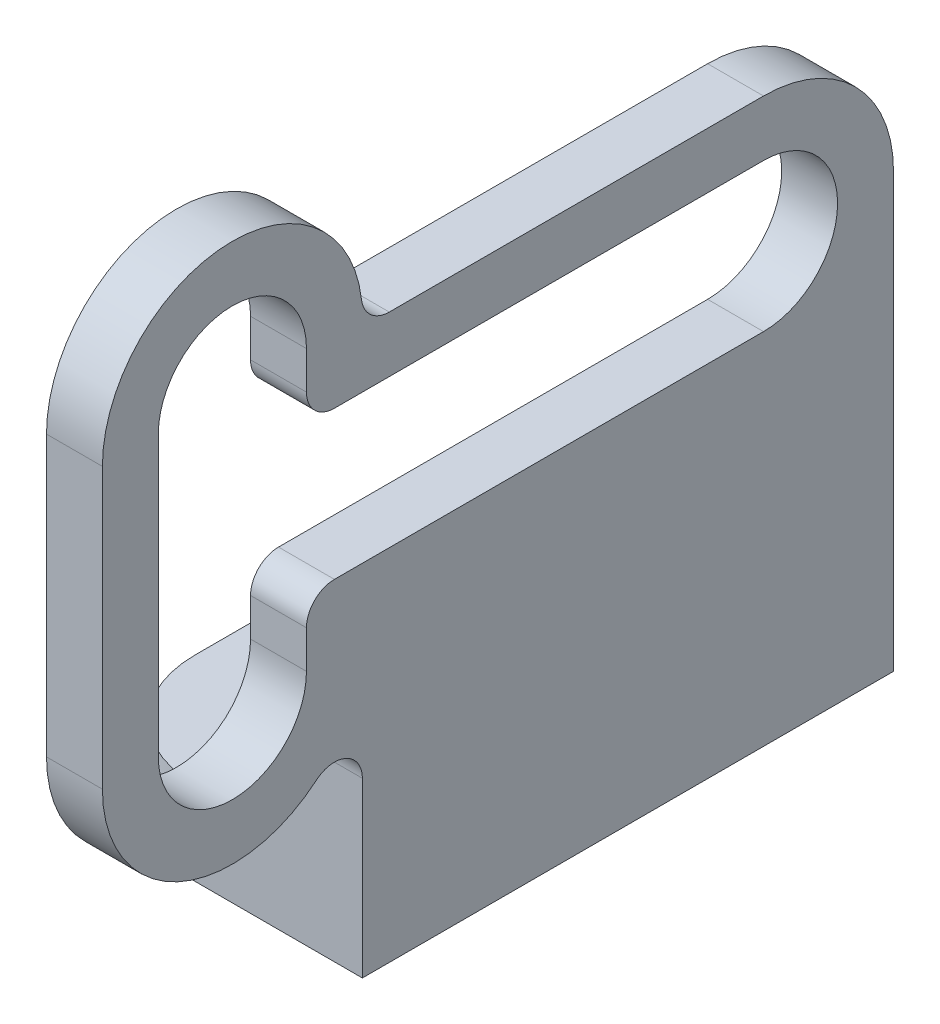
ISO-10303-21;
HEADER;
FILE_DESCRIPTION(('STEP AP214'),'2;1');
FILE_NAME('part.step','',(''),(''),'','','');
FILE_SCHEMA(('AUTOMOTIVE_DESIGN { 1 0 10303 214 1 1 1 1 }'));
ENDSEC;
DATA;
#1=APPLICATION_CONTEXT('core data for automotive mechanical design processes');
#2=APPLICATION_PROTOCOL_DEFINITION('international standard','automotive_design',2000,#1);
#3=PRODUCT_CONTEXT('',#1,'mechanical');
#4=PRODUCT('Part','Part','',(#3));
#5=PRODUCT_RELATED_PRODUCT_CATEGORY('part','',(#4));
#6=PRODUCT_DEFINITION_FORMATION('','',#4);
#7=PRODUCT_DEFINITION_CONTEXT('part definition',#1,'design');
#8=PRODUCT_DEFINITION('design','',#6,#7);
#9=PRODUCT_DEFINITION_SHAPE('','',#8);
#10=(LENGTH_UNIT() NAMED_UNIT(*) SI_UNIT(.MILLI.,.METRE.));
#11=(NAMED_UNIT(*) PLANE_ANGLE_UNIT() SI_UNIT($,.RADIAN.));
#12=(NAMED_UNIT(*) SI_UNIT($,.STERADIAN.) SOLID_ANGLE_UNIT());
#13=UNCERTAINTY_MEASURE_WITH_UNIT(LENGTH_MEASURE(1.E-05),#10,'distance_accuracy_value','');
#14=(GEOMETRIC_REPRESENTATION_CONTEXT(3) GLOBAL_UNCERTAINTY_ASSIGNED_CONTEXT((#13)) GLOBAL_UNIT_ASSIGNED_CONTEXT((#10,
#11,#12)) REPRESENTATION_CONTEXT('',''));
#15=CARTESIAN_POINT('',(0.,0.,0.));
#16=DIRECTION('',(0.,0.,1.));
#17=DIRECTION('',(1.,0.,0.));
#18=AXIS2_PLACEMENT_3D('',#15,#16,#17);
#19=CARTESIAN_POINT('',(-20.,-3.,-6.14999999999999));
#20=DIRECTION('',(0.,0.,-1.));
#21=DIRECTION('',(-1.,0.,0.));
#22=AXIS2_PLACEMENT_3D('',#19,#20,#21);
#23=CYLINDRICAL_SURFACE('',#22,4.);
#24=CARTESIAN_POINT('',(-20.,-7.,9.85000000000003));
#25=CARTESIAN_POINT('',(-19.9723233150158,-7.00000157780632,9.85000030077385));
#26=CARTESIAN_POINT('',(-19.9446602914708,-6.99971239882661,9.84885026689788));
#27=CARTESIAN_POINT('',(-19.8895402479927,-6.99856932536045,9.84426551968395));
#28=CARTESIAN_POINT('',(-19.8620831966923,-6.99771551870197,9.84083116167271));
#29=CARTESIAN_POINT('',(-19.7804278885431,-6.99433848960047,9.82715048730345));
#30=CARTESIAN_POINT('',(-19.7267894006055,-6.99099947175457,9.81352636101654));
#31=CARTESIAN_POINT('',(-19.6226488001989,-6.98250473560501,9.7777085120359));
#32=CARTESIAN_POINT('',(-19.572146569824,-6.97734908564534,9.75551511172608));
#33=CARTESIAN_POINT('',(-19.4755635423254,-6.96577019980751,9.70321851491648));
#34=CARTESIAN_POINT('',(-19.4294837750132,-6.95934666975096,9.67311348219123));
#35=CARTESIAN_POINT('',(-19.3421330009245,-6.94578302077196,9.60520070995904));
#36=CARTESIAN_POINT('',(-19.3009657505514,-6.938631915424,9.56726176327822));
#37=CARTESIAN_POINT('',(-19.2255034509248,-6.9244913182034,9.48503516637235));
#38=CARTESIAN_POINT('',(-19.1912096880392,-6.91750185679842,9.44074633042596));
#39=CARTESIAN_POINT('',(-19.1299814585968,-6.90436500143525,9.34626861825899));
#40=CARTESIAN_POINT('',(-19.1031637938485,-6.89823164771277,9.29600191845788));
#41=CARTESIAN_POINT('',(-19.0584011478602,-6.88766306914139,9.19149826378965));
#42=CARTESIAN_POINT('',(-19.040454292812,-6.88322748571199,9.13726215017519));
#43=CARTESIAN_POINT('',(-19.0142969191061,-6.87666988175583,9.02750495096397));
#44=CARTESIAN_POINT('',(-19.005898676279,-6.87450332247308,8.97203132676069));
#45=CARTESIAN_POINT('',(-18.9984921293181,-6.87259574483986,8.86042222547185));
#46=CARTESIAN_POINT('',(-18.9994825094147,-6.87285438660927,8.80428684222988));
#47=CARTESIAN_POINT('',(-19.0106756737874,-6.87572804296535,8.6943892169542));
#48=CARTESIAN_POINT('',(-19.0206545261121,-6.87828577652537,8.64060243542771));
#49=CARTESIAN_POINT('',(-19.0491840456145,-6.88537810505013,8.53549217150337));
#50=CARTESIAN_POINT('',(-19.0677352466789,-6.88991282314067,8.48416884274939));
#51=CARTESIAN_POINT('',(-19.113073935125,-6.90050082211051,8.3848407368435));
#52=CARTESIAN_POINT('',(-19.139942801472,-6.90656899329422,8.33687475958695));
#53=CARTESIAN_POINT('',(-19.2010966777035,-6.91953156775527,8.24605317888791));
#54=CARTESIAN_POINT('',(-19.2353828112966,-6.92642609615423,8.20319835130731));
#55=CARTESIAN_POINT('',(-19.3115531373298,-6.94050506331232,8.12253556836338));
#56=CARTESIAN_POINT('',(-19.3536255174734,-6.9476921736544,8.08490558417868));
#57=CARTESIAN_POINT('',(-19.4435819338675,-6.96137161942668,8.01719264017566));
#58=CARTESIAN_POINT('',(-19.4914674603803,-6.96786377589194,7.98711162170339));
#59=CARTESIAN_POINT('',(-19.591952127013,-6.97945529302574,7.93528313268396));
#60=CARTESIAN_POINT('',(-19.6445691952407,-6.98454903204387,7.91356916065193));
#61=CARTESIAN_POINT('',(-19.7528315230664,-6.99272331818904,7.87937181250502));
#62=CARTESIAN_POINT('',(-19.8084722183787,-6.99580681316378,7.86687491680075));
#63=CARTESIAN_POINT('',(-19.8871612160415,-6.99847177812262,7.85612756974165));
#64=CARTESIAN_POINT('',(-19.9096829103926,-6.99904410069706,7.85382928717722));
#65=CARTESIAN_POINT('',(-19.9547995093495,-6.99980800384184,7.8507672471564));
#66=CARTESIAN_POINT('',(-19.9773942321029,-7.00000021041085,7.85000096668091));
#67=CARTESIAN_POINT('',(-20.,-7.,7.84999999999999));
#68=B_SPLINE_CURVE_WITH_KNOTS('',3,(#24,#25,#26,#27,#28,#29,#30,#31,#32,#33,#34,#35,#36,#37,#38,
#39,#40,#41,#42,#43,#44,#45,#46,#47,#48,#49,#50,#51,#52,#53,#54,#55,#56,#57,#58,#59,#60,#61,#62,
#63,#64,#65,#66,#67),.UNSPECIFIED.,.F.,.F.,(4,2,2,2,2,2,2,2,2,2,2,2,2,2,2,2,2,2,2,2,2,4),(0.,
0.0829777568740204,0.165942609572148,0.331410183897194,0.496871533787462,0.662371319876779,
0.830908015660359,0.99947622356136,1.17054673796954,1.34158110117174,1.50919143567387,
1.6767782807557,1.84030207241865,2.00383604973177,2.16902348594667,2.33423596544216,
2.50414213597092,2.67409195611343,2.84471529197711,3.01508785741647,3.08298130683383,
3.15076285167842),.UNSPECIFIED.);
#69=CARTESIAN_POINT('',(-20.,-7.,9.85000000000003));
#70=VERTEX_POINT('',#69);
#71=CARTESIAN_POINT('',(-20.,-7.,7.85));
#72=VERTEX_POINT('',#71);
#73=EDGE_CURVE('E224',#70,#72,#68,.T.);
#74=ORIENTED_EDGE('',*,*,#73,.F.);
#75=DIRECTION('',(0.,0.,-1.));
#76=VECTOR('',#75,1.);
#77=CARTESIAN_POINT('',(-20.,-7.,-6.14999999999999));
#78=LINE('',#77,#76);
#79=CARTESIAN_POINT('',(-20.,-7.,12.85));
#80=VERTEX_POINT('',#79);
#81=EDGE_CURVE('E238',#80,#70,#78,.T.);
#82=ORIENTED_EDGE('',*,*,#81,.F.);
#83=CARTESIAN_POINT('',(-20.,-3.,12.85));
#84=DIRECTION('',(0.,0.,-1.));
#85=DIRECTION('',(0.,1.,0.));
#86=AXIS2_PLACEMENT_3D('',#83,#84,#85);
#87=CIRCLE('',#86,4.);
#88=CARTESIAN_POINT('',(-16.0834451217956,-3.81277173056957,12.85));
#89=VERTEX_POINT('',#88);
#90=EDGE_CURVE('E271',#89,#80,#87,.T.);
#91=ORIENTED_EDGE('',*,*,#90,.F.);
#92=CARTESIAN_POINT('',(-16.0834451217956,-3.81277173056957,12.85));
#93=CARTESIAN_POINT('',(-16.0778019953838,-3.78558602238399,12.8500000466087));
#94=CARTESIAN_POINT('',(-16.0724474853253,-3.75835212004865,12.8511094640094));
#95=CARTESIAN_POINT('',(-16.0623341735083,-3.70395442973958,12.8555632394884));
#96=CARTESIAN_POINT('',(-16.0575754239972,-3.67679064811963,12.8589077934219));
#97=CARTESIAN_POINT('',(-16.044243419014,-3.59579193120104,12.8722966076922));
#98=CARTESIAN_POINT('',(-16.0365870044108,-3.5423168308771,12.8856958915239));
#99=CARTESIAN_POINT('',(-16.0237028252213,-3.43799048877666,12.9212456464461));
#100=CARTESIAN_POINT('',(-16.0184786448804,-3.38714321688675,12.9434089442447));
#101=CARTESIAN_POINT('',(-16.0102034467824,-3.28968084018342,12.9959288242315));
#102=CARTESIAN_POINT('',(-16.0071518673569,-3.24306464425842,13.0262832860107));
#103=CARTESIAN_POINT('',(-16.003073968363,-3.16133815908622,13.0897752484205));
#104=CARTESIAN_POINT('',(-16.0018314800697,-3.12552277975823,13.1219985853475));
#105=CARTESIAN_POINT('',(-16.0002934395505,-3.05885238614823,13.1912664165865));
#106=CARTESIAN_POINT('',(-15.9999982499756,-3.02799927584719,13.2283127516243));
#107=CARTESIAN_POINT('',(-16.,-3.,13.2674177191272));
#108=B_SPLINE_CURVE_WITH_KNOTS('',3,(#92,#93,#94,#95,#96,#97,#98,#99,#100,#101,#102,#103,#104,
#105,#106,#107),.UNSPECIFIED.,.F.,.F.,(4,2,2,2,2,2,2,4),(0.,0.0832480723519854,
0.166503440324673,0.332612520237432,0.498965616849194,0.665275691641267,0.80935828184659,
0.953496024122987),.UNSPECIFIED.);
#109=CARTESIAN_POINT('',(-16.,-3.,13.2674177191272));
#110=VERTEX_POINT('',#109);
#111=EDGE_CURVE('E290',#89,#110,#108,.T.);
#112=ORIENTED_EDGE('',*,*,#111,.T.);
#113=DIRECTION('',(0.,0.,-1.));
#114=VECTOR('',#113,1.);
#115=CARTESIAN_POINT('',(-16.,-3.,17.5));
#116=LINE('',#115,#114);
#117=CARTESIAN_POINT('',(-16.,-3.,-6.14999999999999));
#118=VERTEX_POINT('',#117);
#119=EDGE_CURVE('E55',#118,#110,#116,.F.);
#120=ORIENTED_EDGE('',*,*,#119,.F.);
#121=CARTESIAN_POINT('',(-20.,-3.,-6.14999999999999));
#122=DIRECTION('',(0.,0.,-1.));
#123=DIRECTION('',(0.,1.,0.));
#124=AXIS2_PLACEMENT_3D('',#121,#122,#123);
#125=CIRCLE('',#124,4.);
#126=CARTESIAN_POINT('',(-20.,-7.,-6.14999999999999));
#127=VERTEX_POINT('',#126);
#128=EDGE_CURVE('E268',#127,#118,#125,.F.);
#129=ORIENTED_EDGE('',*,*,#128,.F.);
#130=CARTESIAN_POINT('',(-20.,-7.,-3.15));
#131=VERTEX_POINT('',#130);
#132=EDGE_CURVE('E220',#131,#127,#78,.T.);
#133=ORIENTED_EDGE('',*,*,#132,.F.);
#134=CARTESIAN_POINT('',(-20.,-7.,-1.14999999999998));
#135=CARTESIAN_POINT('',(-19.9723233150158,-7.00000157780632,-1.14999969922615));
#136=CARTESIAN_POINT('',(-19.9446602914708,-6.99971239882661,-1.15114973310212));
#137=CARTESIAN_POINT('',(-19.8895402479927,-6.99856932536045,-1.15573448031605));
#138=CARTESIAN_POINT('',(-19.8620831966923,-6.99771551870197,-1.1591688383273));
#139=CARTESIAN_POINT('',(-19.7804278885431,-6.99433848960047,-1.17284951269655));
#140=CARTESIAN_POINT('',(-19.7267894006055,-6.99099947175457,-1.18647363898346));
#141=CARTESIAN_POINT('',(-19.6226488001989,-6.98250473560501,-1.2222914879641));
#142=CARTESIAN_POINT('',(-19.572146569824,-6.97734908564534,-1.24448488827392));
#143=CARTESIAN_POINT('',(-19.4755635423254,-6.96577019980751,-1.29678148508352));
#144=CARTESIAN_POINT('',(-19.4294837750132,-6.95934666975096,-1.32688651780877));
#145=CARTESIAN_POINT('',(-19.3421330009245,-6.94578302077196,-1.39479929004097));
#146=CARTESIAN_POINT('',(-19.3009657505514,-6.938631915424,-1.43273823672178));
#147=CARTESIAN_POINT('',(-19.2255034509248,-6.9244913182034,-1.51496483362765));
#148=CARTESIAN_POINT('',(-19.1912096880392,-6.91750185679842,-1.55925366957404));
#149=CARTESIAN_POINT('',(-19.1299814585968,-6.90436500143525,-1.65373138174101));
#150=CARTESIAN_POINT('',(-19.1031637938485,-6.89823164771277,-1.70399808154212));
#151=CARTESIAN_POINT('',(-19.0584011478602,-6.88766306914139,-1.80850173621035));
#152=CARTESIAN_POINT('',(-19.040454292812,-6.88322748571199,-1.86273784982482));
#153=CARTESIAN_POINT('',(-19.0142969191061,-6.87666988175583,-1.97249504903603));
#154=CARTESIAN_POINT('',(-19.005898676279,-6.87450332247308,-2.02796867323932));
#155=CARTESIAN_POINT('',(-18.9984921293181,-6.87259574483986,-2.13957777452815));
#156=CARTESIAN_POINT('',(-18.9994825094147,-6.87285438660927,-2.19571315777013));
#157=CARTESIAN_POINT('',(-19.0106756737874,-6.87572804296535,-2.3056107830458));
#158=CARTESIAN_POINT('',(-19.0206545261121,-6.87828577652537,-2.35939756457229));
#159=CARTESIAN_POINT('',(-19.0491840456145,-6.88537810505013,-2.46450782849664));
#160=CARTESIAN_POINT('',(-19.0677352466789,-6.88991282314067,-2.51583115725061));
#161=CARTESIAN_POINT('',(-19.113073935125,-6.90050082211051,-2.61515926315651));
#162=CARTESIAN_POINT('',(-19.139942801472,-6.90656899329422,-2.66312524041305));
#163=CARTESIAN_POINT('',(-19.2010966777035,-6.91953156775527,-2.75394682111209));
#164=CARTESIAN_POINT('',(-19.2353828112966,-6.92642609615423,-2.79680164869269));
#165=CARTESIAN_POINT('',(-19.3115531373298,-6.94050506331232,-2.87746443163662));
#166=CARTESIAN_POINT('',(-19.3536255174734,-6.9476921736544,-2.91509441582132));
#167=CARTESIAN_POINT('',(-19.4435819338675,-6.96137161942668,-2.98280735982434));
#168=CARTESIAN_POINT('',(-19.4914674603803,-6.96786377589194,-3.01288837829661));
#169=CARTESIAN_POINT('',(-19.591952127013,-6.97945529302574,-3.06471686731604));
#170=CARTESIAN_POINT('',(-19.6445691952407,-6.98454903204387,-3.08643083934807));
#171=CARTESIAN_POINT('',(-19.7528315230664,-6.99272331818904,-3.12062818749498));
#172=CARTESIAN_POINT('',(-19.8084722183787,-6.99580681316378,-3.13312508319925));
#173=CARTESIAN_POINT('',(-19.8871612160415,-6.99847177812262,-3.14387243025835));
#174=CARTESIAN_POINT('',(-19.9096829103926,-6.99904410069706,-3.14617071282278));
#175=CARTESIAN_POINT('',(-19.9547995093495,-6.99980800384184,-3.14923275284361));
#176=CARTESIAN_POINT('',(-19.9773942321029,-7.00000021041085,-3.1499990333191));
#177=CARTESIAN_POINT('',(-20.,-7.,-3.15000000000002));
#178=B_SPLINE_CURVE_WITH_KNOTS('',3,(#134,#135,#136,#137,#138,#139,#140,#141,#142,#143,#144,
#145,#146,#147,#148,#149,#150,#151,#152,#153,#154,#155,#156,#157,#158,#159,#160,#161,#162,#163,
#164,#165,#166,#167,#168,#169,#170,#171,#172,#173,#174,#175,#176,#177),.UNSPECIFIED.,.F.,.F.,(4,
2,2,2,2,2,2,2,2,2,2,2,2,2,2,2,2,2,2,2,2,4),(0.,0.0829777568740205,0.165942609572148,
0.331410183897194,0.496871533787462,0.662371319876778,0.83090801566036,0.99947622356136,
1.17054673796954,1.34158110117174,1.50919143567387,1.67677828075569,1.84030207241865,
2.00383604973177,2.16902348594667,2.33423596544216,2.50414213597092,2.67409195611343,
2.84471529197711,3.01508785741647,3.08298130683383,3.15076285167842),.UNSPECIFIED.);
#179=CARTESIAN_POINT('',(-20.,-7.,-1.14999999999998));
#180=VERTEX_POINT('',#179);
#181=EDGE_CURVE('E215',#180,#131,#178,.T.);
#182=ORIENTED_EDGE('',*,*,#181,.F.);
#183=EDGE_CURVE('E218',#72,#180,#78,.T.);
#184=ORIENTED_EDGE('',*,*,#183,.F.);
#185=EDGE_LOOP('',(#74,#82,#91,#112,#120,#129,#133,#182,#184));
#186=FACE_BOUND('',#185,.T.);
#187=ADVANCED_FACE('F39',(#186),#23,.F.);
#188=CARTESIAN_POINT('',(-24.,-7.,-6.14999999999999));
#189=DIRECTION('',(0.,-1.,0.));
#190=DIRECTION('',(0.,0.,-1.));
#191=AXIS2_PLACEMENT_3D('',#188,#189,#190);
#192=PLANE('',#191);
#193=ORIENTED_EDGE('',*,*,#183,.T.);
#194=CARTESIAN_POINT('',(-20.,-7.,-2.14999999999999));
#195=DIRECTION('',(0.,1.,0.));
#196=DIRECTION('',(0.,0.,1.));
#197=AXIS2_PLACEMENT_3D('',#194,#195,#196);
#198=CIRCLE('',#197,1.00000000000001);
#199=EDGE_CURVE('E226',#131,#180,#198,.T.);
#200=ORIENTED_EDGE('',*,*,#199,.F.);
#201=ORIENTED_EDGE('',*,*,#132,.T.);
#202=CARTESIAN_POINT('',(-20.,-7.,-2.14999999999999));
#203=DIRECTION('',(0.,-1.,0.));
#204=DIRECTION('',(0.,0.,-1.));
#205=AXIS2_PLACEMENT_3D('',#202,#203,#204);
#206=CIRCLE('',#205,4.);
#207=CARTESIAN_POINT('',(-24.,-7.,-2.14999999999999));
#208=VERTEX_POINT('',#207);
#209=EDGE_CURVE('E242',#127,#208,#206,.F.);
#210=ORIENTED_EDGE('',*,*,#209,.T.);
#211=DIRECTION('',(0.,0.,-1.));
#212=VECTOR('',#211,1.);
#213=CARTESIAN_POINT('',(-24.,-7.,-6.14999999999999));
#214=LINE('',#213,#212);
#215=CARTESIAN_POINT('',(-24.,-7.,8.85));
#216=VERTEX_POINT('',#215);
#217=EDGE_CURVE('E420',#216,#208,#214,.T.);
#218=ORIENTED_EDGE('',*,*,#217,.F.);
#219=CARTESIAN_POINT('',(-20.,-7.,8.85));
#220=DIRECTION('',(0.,-1.,0.));
#221=DIRECTION('',(0.,0.,-1.));
#222=AXIS2_PLACEMENT_3D('',#219,#220,#221);
#223=CIRCLE('',#222,4.);
#224=EDGE_CURVE('E249',#216,#80,#223,.F.);
#225=ORIENTED_EDGE('',*,*,#224,.T.);
#226=ORIENTED_EDGE('',*,*,#81,.T.);
#227=CARTESIAN_POINT('',(-20.,-7.,8.85000000000001));
#228=DIRECTION('',(0.,1.,0.));
#229=DIRECTION('',(0.,0.,1.));
#230=AXIS2_PLACEMENT_3D('',#227,#228,#229);
#231=CIRCLE('',#230,1.00000000000001);
#232=EDGE_CURVE('E236',#72,#70,#231,.T.);
#233=ORIENTED_EDGE('',*,*,#232,.F.);
#234=EDGE_LOOP('',(#193,#200,#201,#210,#218,#225,#226,#233));
#235=FACE_BOUND('',#234,.T.);
#236=ADVANCED_FACE('F233',(#235),#192,.F.);
#237=CARTESIAN_POINT('',(-16.,5.5,-1.50000000000001));
#238=DIRECTION('',(1.,0.,0.));
#239=DIRECTION('',(0.,0.,-1.));
#240=AXIS2_PLACEMENT_3D('',#237,#238,#239);
#241=CYLINDRICAL_SURFACE('',#240,4.65);
#242=DIRECTION('',(1.,0.,0.));
#243=VECTOR('',#242,1.);
#244=CARTESIAN_POINT('',(-16.,5.5,-6.15));
#245=LINE('',#244,#243);
#246=CARTESIAN_POINT('',(-14.,5.5,-6.15));
#247=VERTEX_POINT('',#246);
#248=CARTESIAN_POINT('',(-16.,5.5,-6.15));
#249=VERTEX_POINT('',#248);
#250=EDGE_CURVE('E448',#247,#249,#245,.F.);
#251=ORIENTED_EDGE('',*,*,#250,.T.);
#252=CARTESIAN_POINT('',(-16.,5.5,-1.50000000000001));
#253=DIRECTION('',(-1.,0.,0.));
#254=DIRECTION('',(0.,0.,1.));
#255=AXIS2_PLACEMENT_3D('',#252,#253,#254);
#256=CIRCLE('',#255,4.65);
#257=CARTESIAN_POINT('',(-16.,10.15,-1.50000000000001));
#258=VERTEX_POINT('',#257);
#259=EDGE_CURVE('E566',#258,#249,#256,.T.);
#260=ORIENTED_EDGE('',*,*,#259,.F.);
#261=DIRECTION('',(1.,0.,0.));
#262=VECTOR('',#261,1.);
#263=CARTESIAN_POINT('',(-16.,10.15,-1.50000000000001));
#264=LINE('',#263,#262);
#265=CARTESIAN_POINT('',(-14.,10.15,-1.50000000000001));
#266=VERTEX_POINT('',#265);
#267=EDGE_CURVE('E602',#258,#266,#264,.T.);
#268=ORIENTED_EDGE('',*,*,#267,.T.);
#269=CARTESIAN_POINT('',(-14.,5.5,-1.50000000000001));
#270=DIRECTION('',(-1.,0.,0.));
#271=DIRECTION('',(0.,0.,1.));
#272=AXIS2_PLACEMENT_3D('',#269,#270,#271);
#273=CIRCLE('',#272,4.65);
#274=EDGE_CURVE('E583',#266,#247,#273,.T.);
#275=ORIENTED_EDGE('',*,*,#274,.T.);
#276=EDGE_LOOP('',(#251,#260,#268,#275));
#277=FACE_BOUND('',#276,.T.);
#278=ADVANCED_FACE('F318',(#277),#241,.T.);
#279=CARTESIAN_POINT('',(-16.,10.5,17.5));
#280=DIRECTION('',(-1.,0.,0.));
#281=DIRECTION('',(0.,0.,1.));
#282=AXIS2_PLACEMENT_3D('',#279,#280,#281);
#283=PLANE('',#282);
#284=DIRECTION('',(0.,-1.,0.));
#285=VECTOR('',#284,1.);
#286=CARTESIAN_POINT('',(-16.,15.152,-6.15));
#287=LINE('',#286,#285);
#288=EDGE_CURVE('E454',#249,#118,#287,.T.);
#289=ORIENTED_EDGE('',*,*,#288,.T.);
#290=ORIENTED_EDGE('',*,*,#119,.T.);
#291=CARTESIAN_POINT('',(-16.,-3.81277173056957,13.85));
#292=DIRECTION('',(-1.,0.,0.));
#293=DIRECTION('',(0.,0.,1.));
#294=AXIS2_PLACEMENT_3D('',#291,#292,#293);
#295=CIRCLE('',#294,1.);
#296=CARTESIAN_POINT('',(-16.,-3.04944930038027,14.496017699115));
#297=VERTEX_POINT('',#296);
#298=EDGE_CURVE('E298',#110,#297,#295,.F.);
#299=ORIENTED_EDGE('',*,*,#298,.T.);
#300=CARTESIAN_POINT('',(-16.,0.500000000000005,17.5));
#301=DIRECTION('',(-1.,0.,0.));
#302=DIRECTION('',(0.,0.,1.));
#303=AXIS2_PLACEMENT_3D('',#300,#301,#302);
#304=CIRCLE('',#303,4.65);
#305=CARTESIAN_POINT('',(-16.,0.500000000000005,22.15));
#306=VERTEX_POINT('',#305);
#307=EDGE_CURVE('E571',#297,#306,#304,.T.);
#308=ORIENTED_EDGE('',*,*,#307,.T.);
#309=DIRECTION('',(0.,1.,0.));
#310=VECTOR('',#309,1.);
#311=CARTESIAN_POINT('',(-16.,0.500000000000003,22.15));
#312=LINE('',#311,#310);
#313=CARTESIAN_POINT('',(-16.,10.5,22.15));
#314=VERTEX_POINT('',#313);
#315=EDGE_CURVE('E574',#306,#314,#312,.T.);
#316=ORIENTED_EDGE('',*,*,#315,.T.);
#317=CARTESIAN_POINT('',(-16.,10.5,17.5));
#318=DIRECTION('',(-1.,0.,0.));
#319=DIRECTION('',(0.,0.,1.));
#320=AXIS2_PLACEMENT_3D('',#317,#318,#319);
#321=CIRCLE('',#320,4.65);
#322=CARTESIAN_POINT('',(-16.,11.0349557522124,12.8808742880091));
#323=VERTEX_POINT('',#322);
#324=EDGE_CURVE('E577',#314,#323,#321,.T.);
#325=ORIENTED_EDGE('',*,*,#324,.T.);
#326=CARTESIAN_POINT('',(-16.,11.15,11.8875139198391));
#327=DIRECTION('',(-1.,0.,0.));
#328=DIRECTION('',(0.,0.,1.));
#329=AXIS2_PLACEMENT_3D('',#326,#327,#328);
#330=CIRCLE('',#329,1.);
#331=CARTESIAN_POINT('',(-16.,10.15,11.8875139198391));
#332=VERTEX_POINT('',#331);
#333=EDGE_CURVE('E11',#323,#332,#330,.F.);
#334=ORIENTED_EDGE('',*,*,#333,.T.);
#335=DIRECTION('',(0.,0.,-1.));
#336=VECTOR('',#335,1.);
#337=CARTESIAN_POINT('',(-16.,10.15,12.85));
#338=LINE('',#337,#336);
#339=EDGE_CURVE('E563',#332,#258,#338,.T.);
#340=ORIENTED_EDGE('',*,*,#339,.T.);
#341=ORIENTED_EDGE('',*,*,#259,.T.);
#342=EDGE_LOOP('',(#289,#290,#299,#308,#316,#325,#334,#340,#341));
#343=FACE_BOUND('',#342,.T.);
#344=DIRECTION('',(0.,0.,-1.));
#345=VECTOR('',#344,1.);
#346=CARTESIAN_POINT('',(-16.,8.15,13.85));
#347=LINE('',#346,#345);
#348=CARTESIAN_POINT('',(-16.,8.15,13.85));
#349=VERTEX_POINT('',#348);
#350=CARTESIAN_POINT('',(-16.,8.15,-1.50000000000001));
#351=VERTEX_POINT('',#350);
#352=EDGE_CURVE('E463',#349,#351,#347,.T.);
#353=ORIENTED_EDGE('',*,*,#352,.F.);
#354=CARTESIAN_POINT('',(-16.,9.15,13.85));
#355=DIRECTION('',(1.,0.,0.));
#356=DIRECTION('',(0.,0.,1.));
#357=AXIS2_PLACEMENT_3D('',#354,#355,#356);
#358=CIRCLE('',#357,0.999999999999997);
#359=CARTESIAN_POINT('',(-16.,9.15,14.85));
#360=VERTEX_POINT('',#359);
#361=EDGE_CURVE('E460',#360,#349,#358,.T.);
#362=ORIENTED_EDGE('',*,*,#361,.F.);
#363=DIRECTION('',(0.,-1.,0.));
#364=VECTOR('',#363,1.);
#365=CARTESIAN_POINT('',(-16.,9.15,14.85));
#366=LINE('',#365,#364);
#367=CARTESIAN_POINT('',(-16.,10.5,14.85));
#368=VERTEX_POINT('',#367);
#369=EDGE_CURVE('E489',#368,#360,#366,.T.);
#370=ORIENTED_EDGE('',*,*,#369,.F.);
#371=CARTESIAN_POINT('',(-16.,10.5,17.5));
#372=DIRECTION('',(-1.,0.,0.));
#373=DIRECTION('',(0.,0.,1.));
#374=AXIS2_PLACEMENT_3D('',#371,#372,#373);
#375=CIRCLE('',#374,2.65);
#376=CARTESIAN_POINT('',(-16.,10.5,20.15));
#377=VERTEX_POINT('',#376);
#378=EDGE_CURVE('E485',#377,#368,#375,.T.);
#379=ORIENTED_EDGE('',*,*,#378,.F.);
#380=DIRECTION('',(0.,1.,0.));
#381=VECTOR('',#380,1.);
#382=CARTESIAN_POINT('',(-16.,0.500000000000005,20.15));
#383=LINE('',#382,#381);
#384=CARTESIAN_POINT('',(-16.,0.500000000000005,20.15));
#385=VERTEX_POINT('',#384);
#386=EDGE_CURVE('E482',#385,#377,#383,.T.);
#387=ORIENTED_EDGE('',*,*,#386,.F.);
#388=CARTESIAN_POINT('',(-16.,0.500000000000005,17.5));
#389=DIRECTION('',(-1.,0.,0.));
#390=DIRECTION('',(0.,0.,1.));
#391=AXIS2_PLACEMENT_3D('',#388,#389,#390);
#392=CIRCLE('',#391,2.65);
#393=CARTESIAN_POINT('',(-16.,0.500000000000003,14.85));
#394=VERTEX_POINT('',#393);
#395=EDGE_CURVE('E479',#394,#385,#392,.T.);
#396=ORIENTED_EDGE('',*,*,#395,.F.);
#397=DIRECTION('',(0.,-1.,0.));
#398=VECTOR('',#397,1.);
#399=CARTESIAN_POINT('',(-16.,0.500000000000003,14.85));
#400=LINE('',#399,#398);
#401=CARTESIAN_POINT('',(-16.,1.85000000000001,14.85));
#402=VERTEX_POINT('',#401);
#403=EDGE_CURVE('E476',#402,#394,#400,.T.);
#404=ORIENTED_EDGE('',*,*,#403,.F.);
#405=CARTESIAN_POINT('',(-16.,1.85000000000001,13.85));
#406=DIRECTION('',(1.,0.,0.));
#407=DIRECTION('',(0.,0.,1.));
#408=AXIS2_PLACEMENT_3D('',#405,#406,#407);
#409=CIRCLE('',#408,0.999999999999998);
#410=CARTESIAN_POINT('',(-16.,2.85,13.85));
#411=VERTEX_POINT('',#410);
#412=EDGE_CURVE('E473',#411,#402,#409,.T.);
#413=ORIENTED_EDGE('',*,*,#412,.F.);
#414=DIRECTION('',(0.,0.,1.));
#415=VECTOR('',#414,1.);
#416=CARTESIAN_POINT('',(-16.,2.85,13.85));
#417=LINE('',#416,#415);
#418=CARTESIAN_POINT('',(-16.,2.85,-1.50000000000001));
#419=VERTEX_POINT('',#418);
#420=EDGE_CURVE('E470',#419,#411,#417,.T.);
#421=ORIENTED_EDGE('',*,*,#420,.F.);
#422=CARTESIAN_POINT('',(-16.,5.5,-1.50000000000001));
#423=DIRECTION('',(-1.,0.,0.));
#424=DIRECTION('',(0.,0.,1.));
#425=AXIS2_PLACEMENT_3D('',#422,#423,#424);
#426=CIRCLE('',#425,2.65);
#427=EDGE_CURVE('E467',#351,#419,#426,.T.);
#428=ORIENTED_EDGE('',*,*,#427,.F.);
#429=EDGE_LOOP('',(#353,#362,#370,#379,#387,#396,#404,#413,#421,#428));
#430=FACE_BOUND('',#429,.T.);
#431=ADVANCED_FACE('F323',(#343,#430),#283,.T.);
#432=CARTESIAN_POINT('',(-14.,10.5,17.5));
#433=DIRECTION('',(-1.,0.,0.));
#434=DIRECTION('',(0.,0.,1.));
#435=AXIS2_PLACEMENT_3D('',#432,#433,#434);
#436=PLANE('',#435);
#437=DIRECTION('',(0.,0.,-1.));
#438=VECTOR('',#437,1.);
#439=CARTESIAN_POINT('',(-14.,10.15,12.85));
#440=LINE('',#439,#438);
#441=CARTESIAN_POINT('',(-14.,10.15,11.8875139198391));
#442=VERTEX_POINT('',#441);
#443=EDGE_CURVE('E562',#442,#266,#440,.T.);
#444=ORIENTED_EDGE('',*,*,#443,.F.);
#445=CARTESIAN_POINT('',(-14.,11.15,11.8875139198391));
#446=DIRECTION('',(-1.,0.,0.));
#447=DIRECTION('',(0.,0.,1.));
#448=AXIS2_PLACEMENT_3D('',#445,#446,#447);
#449=CIRCLE('',#448,1.);
#450=CARTESIAN_POINT('',(-14.,11.0349557522124,12.8808742880091));
#451=VERTEX_POINT('',#450);
#452=EDGE_CURVE('E48',#442,#451,#449,.T.);
#453=ORIENTED_EDGE('',*,*,#452,.T.);
#454=CARTESIAN_POINT('',(-14.,10.5,17.5));
#455=DIRECTION('',(-1.,0.,0.));
#456=DIRECTION('',(0.,0.,1.));
#457=AXIS2_PLACEMENT_3D('',#454,#455,#456);
#458=CIRCLE('',#457,4.65);
#459=CARTESIAN_POINT('',(-14.,10.5,22.15));
#460=VERTEX_POINT('',#459);
#461=EDGE_CURVE('E567',#460,#451,#458,.T.);
#462=ORIENTED_EDGE('',*,*,#461,.F.);
#463=DIRECTION('',(0.,1.,0.));
#464=VECTOR('',#463,1.);
#465=CARTESIAN_POINT('',(-14.,0.500000000000003,22.15));
#466=LINE('',#465,#464);
#467=CARTESIAN_POINT('',(-14.,0.500000000000005,22.15));
#468=VERTEX_POINT('',#467);
#469=EDGE_CURVE('E590',#468,#460,#466,.T.);
#470=ORIENTED_EDGE('',*,*,#469,.F.);
#471=CARTESIAN_POINT('',(-14.,0.500000000000005,17.5));
#472=DIRECTION('',(-1.,0.,0.));
#473=DIRECTION('',(0.,0.,1.));
#474=AXIS2_PLACEMENT_3D('',#471,#472,#473);
#475=CIRCLE('',#474,4.65);
#476=CARTESIAN_POINT('',(-14.,-3.04944930038027,14.496017699115));
#477=VERTEX_POINT('',#476);
#478=EDGE_CURVE('E587',#477,#468,#475,.T.);
#479=ORIENTED_EDGE('',*,*,#478,.F.);
#480=CARTESIAN_POINT('',(-14.,-3.81277173056957,13.85));
#481=DIRECTION('',(-1.,0.,0.));
#482=DIRECTION('',(0.,0.,1.));
#483=AXIS2_PLACEMENT_3D('',#480,#481,#482);
#484=CIRCLE('',#483,1.);
#485=CARTESIAN_POINT('',(-14.,-3.81277173056957,12.85));
#486=VERTEX_POINT('',#485);
#487=EDGE_CURVE('E287',#477,#486,#484,.T.);
#488=ORIENTED_EDGE('',*,*,#487,.T.);
#489=DIRECTION('',(0.,1.,0.));
#490=VECTOR('',#489,1.);
#491=CARTESIAN_POINT('',(-14.,-9.99999999999999,12.85));
#492=LINE('',#491,#490);
#493=CARTESIAN_POINT('',(-14.,-9.99999999999999,12.85));
#494=VERTEX_POINT('',#493);
#495=EDGE_CURVE('E444',#494,#486,#492,.T.);
#496=ORIENTED_EDGE('',*,*,#495,.F.);
#497=DIRECTION('',(0.,0.,1.));
#498=VECTOR('',#497,1.);
#499=CARTESIAN_POINT('',(-14.,-10.,-6.14999999999999));
#500=LINE('',#499,#498);
#501=CARTESIAN_POINT('',(-14.,-10.,-6.14999999999999));
#502=VERTEX_POINT('',#501);
#503=EDGE_CURVE('E432',#502,#494,#500,.T.);
#504=ORIENTED_EDGE('',*,*,#503,.F.);
#505=DIRECTION('',(0.,-1.,0.));
#506=VECTOR('',#505,1.);
#507=CARTESIAN_POINT('',(-14.,15.152,-6.15));
#508=LINE('',#507,#506);
#509=EDGE_CURVE('E449',#247,#502,#508,.T.);
#510=ORIENTED_EDGE('',*,*,#509,.F.);
#511=ORIENTED_EDGE('',*,*,#274,.F.);
#512=EDGE_LOOP('',(#444,#453,#462,#470,#479,#488,#496,#504,#510,#511));
#513=FACE_BOUND('',#512,.T.);
#514=CARTESIAN_POINT('',(-14.,9.15,13.85));
#515=DIRECTION('',(1.,0.,0.));
#516=DIRECTION('',(0.,0.,1.));
#517=AXIS2_PLACEMENT_3D('',#514,#515,#516);
#518=CIRCLE('',#517,0.999999999999997);
#519=CARTESIAN_POINT('',(-14.,9.15,14.85));
#520=VERTEX_POINT('',#519);
#521=CARTESIAN_POINT('',(-14.,8.15,13.85));
#522=VERTEX_POINT('',#521);
#523=EDGE_CURVE('E453',#520,#522,#518,.T.);
#524=ORIENTED_EDGE('',*,*,#523,.T.);
#525=DIRECTION('',(0.,0.,-1.));
#526=VECTOR('',#525,1.);
#527=CARTESIAN_POINT('',(-14.,8.15,13.85));
#528=LINE('',#527,#526);
#529=CARTESIAN_POINT('',(-14.,8.15,-1.50000000000001));
#530=VERTEX_POINT('',#529);
#531=EDGE_CURVE('E496',#522,#530,#528,.T.);
#532=ORIENTED_EDGE('',*,*,#531,.T.);
#533=CARTESIAN_POINT('',(-14.,5.5,-1.50000000000001));
#534=DIRECTION('',(-1.,0.,0.));
#535=DIRECTION('',(0.,0.,1.));
#536=AXIS2_PLACEMENT_3D('',#533,#534,#535);
#537=CIRCLE('',#536,2.65);
#538=CARTESIAN_POINT('',(-14.,2.85,-1.50000000000001));
#539=VERTEX_POINT('',#538);
#540=EDGE_CURVE('E500',#530,#539,#537,.T.);
#541=ORIENTED_EDGE('',*,*,#540,.T.);
#542=DIRECTION('',(0.,0.,1.));
#543=VECTOR('',#542,1.);
#544=CARTESIAN_POINT('',(-14.,2.85,13.85));
#545=LINE('',#544,#543);
#546=CARTESIAN_POINT('',(-14.,2.85,13.85));
#547=VERTEX_POINT('',#546);
#548=EDGE_CURVE('E504',#539,#547,#545,.T.);
#549=ORIENTED_EDGE('',*,*,#548,.T.);
#550=CARTESIAN_POINT('',(-14.,1.85000000000001,13.85));
#551=DIRECTION('',(1.,0.,0.));
#552=DIRECTION('',(0.,0.,1.));
#553=AXIS2_PLACEMENT_3D('',#550,#551,#552);
#554=CIRCLE('',#553,0.999999999999998);
#555=CARTESIAN_POINT('',(-14.,1.85000000000001,14.85));
#556=VERTEX_POINT('',#555);
#557=EDGE_CURVE('E508',#547,#556,#554,.T.);
#558=ORIENTED_EDGE('',*,*,#557,.T.);
#559=DIRECTION('',(0.,-1.,0.));
#560=VECTOR('',#559,1.);
#561=CARTESIAN_POINT('',(-14.,0.500000000000003,14.85));
#562=LINE('',#561,#560);
#563=CARTESIAN_POINT('',(-14.,0.500000000000003,14.85));
#564=VERTEX_POINT('',#563);
#565=EDGE_CURVE('E512',#556,#564,#562,.T.);
#566=ORIENTED_EDGE('',*,*,#565,.T.);
#567=CARTESIAN_POINT('',(-14.,0.500000000000005,17.5));
#568=DIRECTION('',(-1.,0.,0.));
#569=DIRECTION('',(0.,0.,1.));
#570=AXIS2_PLACEMENT_3D('',#567,#568,#569);
#571=CIRCLE('',#570,2.65);
#572=CARTESIAN_POINT('',(-14.,0.500000000000005,20.15));
#573=VERTEX_POINT('',#572);
#574=EDGE_CURVE('E516',#564,#573,#571,.T.);
#575=ORIENTED_EDGE('',*,*,#574,.T.);
#576=DIRECTION('',(0.,1.,0.));
#577=VECTOR('',#576,1.);
#578=CARTESIAN_POINT('',(-14.,0.500000000000005,20.15));
#579=LINE('',#578,#577);
#580=CARTESIAN_POINT('',(-14.,10.5,20.15));
#581=VERTEX_POINT('',#580);
#582=EDGE_CURVE('E520',#573,#581,#579,.T.);
#583=ORIENTED_EDGE('',*,*,#582,.T.);
#584=CARTESIAN_POINT('',(-14.,10.5,17.5));
#585=DIRECTION('',(-1.,0.,0.));
#586=DIRECTION('',(0.,0.,1.));
#587=AXIS2_PLACEMENT_3D('',#584,#585,#586);
#588=CIRCLE('',#587,2.65);
#589=CARTESIAN_POINT('',(-14.,10.5,14.85));
#590=VERTEX_POINT('',#589);
#591=EDGE_CURVE('E524',#581,#590,#588,.T.);
#592=ORIENTED_EDGE('',*,*,#591,.T.);
#593=DIRECTION('',(0.,-1.,0.));
#594=VECTOR('',#593,1.);
#595=CARTESIAN_POINT('',(-14.,9.15,14.85));
#596=LINE('',#595,#594);
#597=EDGE_CURVE('E464',#590,#520,#596,.T.);
#598=ORIENTED_EDGE('',*,*,#597,.T.);
#599=EDGE_LOOP('',(#524,#532,#541,#549,#558,#566,#575,#583,#592,#598));
#600=FACE_BOUND('',#599,.T.);
#601=ADVANCED_FACE('F385',(#513,#600),#436,.F.);
#602=CARTESIAN_POINT('',(-16.,10.15,12.85));
#603=DIRECTION('',(0.,-1.,0.));
#604=DIRECTION('',(0.,0.,-1.));
#605=AXIS2_PLACEMENT_3D('',#602,#603,#604);
#606=PLANE('',#605);
#607=ORIENTED_EDGE('',*,*,#339,.F.);
#608=DIRECTION('',(-1.,0.,0.));
#609=VECTOR('',#608,1.);
#610=CARTESIAN_POINT('',(-14.,10.15,11.8875139198391));
#611=LINE('',#610,#609);
#612=EDGE_CURVE('E281',#332,#442,#611,.F.);
#613=ORIENTED_EDGE('',*,*,#612,.T.);
#614=ORIENTED_EDGE('',*,*,#443,.T.);
#615=ORIENTED_EDGE('',*,*,#267,.F.);
#616=EDGE_LOOP('',(#607,#613,#614,#615));
#617=FACE_BOUND('',#616,.T.);
#618=ADVANCED_FACE('F388',(#617),#606,.F.);
#619=CARTESIAN_POINT('',(-16.,0.500000000000005,17.5));
#620=DIRECTION('',(1.,0.,0.));
#621=DIRECTION('',(0.,0.,-1.));
#622=AXIS2_PLACEMENT_3D('',#619,#620,#621);
#623=CYLINDRICAL_SURFACE('',#622,4.65);
#624=ORIENTED_EDGE('',*,*,#307,.F.);
#625=DIRECTION('',(1.,0.,0.));
#626=VECTOR('',#625,1.);
#627=CARTESIAN_POINT('',(-16.,-3.04944930038027,14.496017699115));
#628=LINE('',#627,#626);
#629=EDGE_CURVE('E274',#297,#477,#628,.T.);
#630=ORIENTED_EDGE('',*,*,#629,.T.);
#631=ORIENTED_EDGE('',*,*,#478,.T.);
#632=DIRECTION('',(1.,0.,0.));
#633=VECTOR('',#632,1.);
#634=CARTESIAN_POINT('',(-16.,0.500000000000005,22.15));
#635=LINE('',#634,#633);
#636=EDGE_CURVE('E598',#306,#468,#635,.T.);
#637=ORIENTED_EDGE('',*,*,#636,.F.);
#638=EDGE_LOOP('',(#624,#630,#631,#637));
#639=FACE_BOUND('',#638,.T.);
#640=ADVANCED_FACE('F395',(#639),#623,.T.);
#641=CARTESIAN_POINT('',(-16.,0.500000000000003,22.15));
#642=DIRECTION('',(0.,0.,-1.));
#643=DIRECTION('',(-1.,0.,0.));
#644=AXIS2_PLACEMENT_3D('',#641,#642,#643);
#645=PLANE('',#644);
#646=ORIENTED_EDGE('',*,*,#469,.T.);
#647=DIRECTION('',(1.,0.,0.));
#648=VECTOR('',#647,1.);
#649=CARTESIAN_POINT('',(-16.,10.5,22.15));
#650=LINE('',#649,#648);
#651=EDGE_CURVE('E580',#314,#460,#650,.T.);
#652=ORIENTED_EDGE('',*,*,#651,.F.);
#653=ORIENTED_EDGE('',*,*,#315,.F.);
#654=ORIENTED_EDGE('',*,*,#636,.T.);
#655=EDGE_LOOP('',(#646,#652,#653,#654));
#656=FACE_BOUND('',#655,.T.);
#657=ADVANCED_FACE('F392',(#656),#645,.F.);
#658=CARTESIAN_POINT('',(-16.,10.5,17.5));
#659=DIRECTION('',(1.,0.,0.));
#660=DIRECTION('',(0.,0.,-1.));
#661=AXIS2_PLACEMENT_3D('',#658,#659,#660);
#662=CYLINDRICAL_SURFACE('',#661,4.65);
#663=ORIENTED_EDGE('',*,*,#461,.T.);
#664=DIRECTION('',(1.,0.,0.));
#665=VECTOR('',#664,1.);
#666=CARTESIAN_POINT('',(-16.,11.0349557522124,12.8808742880091));
#667=LINE('',#666,#665);
#668=EDGE_CURVE('E63',#451,#323,#667,.F.);
#669=ORIENTED_EDGE('',*,*,#668,.T.);
#670=ORIENTED_EDGE('',*,*,#324,.F.);
#671=ORIENTED_EDGE('',*,*,#651,.T.);
#672=EDGE_LOOP('',(#663,#669,#670,#671));
#673=FACE_BOUND('',#672,.T.);
#674=ADVANCED_FACE('F381',(#673),#662,.T.);
#675=CARTESIAN_POINT('',(-16.,9.15,13.85));
#676=DIRECTION('',(1.,0.,0.));
#677=DIRECTION('',(0.,0.,-1.));
#678=AXIS2_PLACEMENT_3D('',#675,#676,#677);
#679=CYLINDRICAL_SURFACE('',#678,0.999999999999997);
#680=ORIENTED_EDGE('',*,*,#523,.F.);
#681=DIRECTION('',(1.,0.,0.));
#682=VECTOR('',#681,1.);
#683=CARTESIAN_POINT('',(-16.,9.15,14.85));
#684=LINE('',#683,#682);
#685=EDGE_CURVE('E492',#360,#520,#684,.T.);
#686=ORIENTED_EDGE('',*,*,#685,.F.);
#687=ORIENTED_EDGE('',*,*,#361,.T.);
#688=DIRECTION('',(1.,0.,0.));
#689=VECTOR('',#688,1.);
#690=CARTESIAN_POINT('',(-16.,8.15,13.85));
#691=LINE('',#690,#689);
#692=EDGE_CURVE('E558',#349,#522,#691,.T.);
#693=ORIENTED_EDGE('',*,*,#692,.T.);
#694=EDGE_LOOP('',(#680,#686,#687,#693));
#695=FACE_BOUND('',#694,.T.);
#696=ADVANCED_FACE('F377',(#695),#679,.T.);
#697=CARTESIAN_POINT('',(-16.,8.15,13.85));
#698=DIRECTION('',(0.,-1.,0.));
#699=DIRECTION('',(0.,0.,-1.));
#700=AXIS2_PLACEMENT_3D('',#697,#698,#699);
#701=PLANE('',#700);
#702=ORIENTED_EDGE('',*,*,#531,.F.);
#703=ORIENTED_EDGE('',*,*,#692,.F.);
#704=ORIENTED_EDGE('',*,*,#352,.T.);
#705=DIRECTION('',(1.,0.,0.));
#706=VECTOR('',#705,1.);
#707=CARTESIAN_POINT('',(-16.,8.15,-1.50000000000001));
#708=LINE('',#707,#706);
#709=EDGE_CURVE('E555',#351,#530,#708,.T.);
#710=ORIENTED_EDGE('',*,*,#709,.T.);
#711=EDGE_LOOP('',(#702,#703,#704,#710));
#712=FACE_BOUND('',#711,.T.);
#713=ADVANCED_FACE('F373',(#712),#701,.T.);
#714=CARTESIAN_POINT('',(-16.,5.5,-1.50000000000001));
#715=DIRECTION('',(1.,0.,0.));
#716=DIRECTION('',(0.,0.,-1.));
#717=AXIS2_PLACEMENT_3D('',#714,#715,#716);
#718=CYLINDRICAL_SURFACE('',#717,2.65);
#719=ORIENTED_EDGE('',*,*,#540,.F.);
#720=ORIENTED_EDGE('',*,*,#709,.F.);
#721=ORIENTED_EDGE('',*,*,#427,.T.);
#722=DIRECTION('',(1.,0.,0.));
#723=VECTOR('',#722,1.);
#724=CARTESIAN_POINT('',(-16.,2.85,-1.50000000000001));
#725=LINE('',#724,#723);
#726=EDGE_CURVE('E552',#419,#539,#725,.T.);
#727=ORIENTED_EDGE('',*,*,#726,.T.);
#728=EDGE_LOOP('',(#719,#720,#721,#727));
#729=FACE_BOUND('',#728,.T.);
#730=ADVANCED_FACE('F369',(#729),#718,.F.);
#731=CARTESIAN_POINT('',(-16.,2.85,13.85));
#732=DIRECTION('',(0.,1.,0.));
#733=DIRECTION('',(0.,0.,1.));
#734=AXIS2_PLACEMENT_3D('',#731,#732,#733);
#735=PLANE('',#734);
#736=ORIENTED_EDGE('',*,*,#548,.F.);
#737=ORIENTED_EDGE('',*,*,#726,.F.);
#738=ORIENTED_EDGE('',*,*,#420,.T.);
#739=DIRECTION('',(1.,0.,0.));
#740=VECTOR('',#739,1.);
#741=CARTESIAN_POINT('',(-16.,2.85,13.85));
#742=LINE('',#741,#740);
#743=EDGE_CURVE('E549',#411,#547,#742,.T.);
#744=ORIENTED_EDGE('',*,*,#743,.T.);
#745=EDGE_LOOP('',(#736,#737,#738,#744));
#746=FACE_BOUND('',#745,.T.);
#747=ADVANCED_FACE('F365',(#746),#735,.T.);
#748=CARTESIAN_POINT('',(-16.,1.85000000000001,13.85));
#749=DIRECTION('',(1.,0.,0.));
#750=DIRECTION('',(0.,0.,-1.));
#751=AXIS2_PLACEMENT_3D('',#748,#749,#750);
#752=CYLINDRICAL_SURFACE('',#751,0.999999999999998);
#753=ORIENTED_EDGE('',*,*,#557,.F.);
#754=ORIENTED_EDGE('',*,*,#743,.F.);
#755=ORIENTED_EDGE('',*,*,#412,.T.);
#756=DIRECTION('',(1.,0.,0.));
#757=VECTOR('',#756,1.);
#758=CARTESIAN_POINT('',(-16.,1.85000000000001,14.85));
#759=LINE('',#758,#757);
#760=EDGE_CURVE('E546',#402,#556,#759,.T.);
#761=ORIENTED_EDGE('',*,*,#760,.T.);
#762=EDGE_LOOP('',(#753,#754,#755,#761));
#763=FACE_BOUND('',#762,.T.);
#764=ADVANCED_FACE('F361',(#763),#752,.T.);
#765=CARTESIAN_POINT('',(-16.,0.500000000000003,14.85));
#766=DIRECTION('',(0.,0.,1.));
#767=DIRECTION('',(1.,0.,0.));
#768=AXIS2_PLACEMENT_3D('',#765,#766,#767);
#769=PLANE('',#768);
#770=ORIENTED_EDGE('',*,*,#565,.F.);
#771=ORIENTED_EDGE('',*,*,#760,.F.);
#772=ORIENTED_EDGE('',*,*,#403,.T.);
#773=DIRECTION('',(1.,0.,0.));
#774=VECTOR('',#773,1.);
#775=CARTESIAN_POINT('',(-16.,0.500000000000003,14.85));
#776=LINE('',#775,#774);
#777=EDGE_CURVE('E543',#394,#564,#776,.T.);
#778=ORIENTED_EDGE('',*,*,#777,.T.);
#779=EDGE_LOOP('',(#770,#771,#772,#778));
#780=FACE_BOUND('',#779,.T.);
#781=ADVANCED_FACE('F357',(#780),#769,.T.);
#782=CARTESIAN_POINT('',(-16.,0.500000000000005,17.5));
#783=DIRECTION('',(1.,0.,0.));
#784=DIRECTION('',(0.,0.,-1.));
#785=AXIS2_PLACEMENT_3D('',#782,#783,#784);
#786=CYLINDRICAL_SURFACE('',#785,2.65);
#787=ORIENTED_EDGE('',*,*,#574,.F.);
#788=ORIENTED_EDGE('',*,*,#777,.F.);
#789=ORIENTED_EDGE('',*,*,#395,.T.);
#790=DIRECTION('',(1.,0.,0.));
#791=VECTOR('',#790,1.);
#792=CARTESIAN_POINT('',(-16.,0.500000000000005,20.15));
#793=LINE('',#792,#791);
#794=EDGE_CURVE('E540',#385,#573,#793,.T.);
#795=ORIENTED_EDGE('',*,*,#794,.T.);
#796=EDGE_LOOP('',(#787,#788,#789,#795));
#797=FACE_BOUND('',#796,.T.);
#798=ADVANCED_FACE('F353',(#797),#786,.F.);
#799=CARTESIAN_POINT('',(-16.,0.500000000000005,20.15));
#800=DIRECTION('',(0.,0.,-1.));
#801=DIRECTION('',(0.,1.,0.));
#802=AXIS2_PLACEMENT_3D('',#799,#800,#801);
#803=PLANE('',#802);
#804=ORIENTED_EDGE('',*,*,#582,.F.);
#805=ORIENTED_EDGE('',*,*,#794,.F.);
#806=ORIENTED_EDGE('',*,*,#386,.T.);
#807=DIRECTION('',(1.,0.,0.));
#808=VECTOR('',#807,1.);
#809=CARTESIAN_POINT('',(-16.,10.5,20.15));
#810=LINE('',#809,#808);
#811=EDGE_CURVE('E537',#377,#581,#810,.T.);
#812=ORIENTED_EDGE('',*,*,#811,.T.);
#813=EDGE_LOOP('',(#804,#805,#806,#812));
#814=FACE_BOUND('',#813,.T.);
#815=ADVANCED_FACE('F349',(#814),#803,.T.);
#816=CARTESIAN_POINT('',(-16.,10.5,17.5));
#817=DIRECTION('',(1.,0.,0.));
#818=DIRECTION('',(0.,0.,-1.));
#819=AXIS2_PLACEMENT_3D('',#816,#817,#818);
#820=CYLINDRICAL_SURFACE('',#819,2.65);
#821=ORIENTED_EDGE('',*,*,#591,.F.);
#822=ORIENTED_EDGE('',*,*,#811,.F.);
#823=ORIENTED_EDGE('',*,*,#378,.T.);
#824=DIRECTION('',(1.,0.,0.));
#825=VECTOR('',#824,1.);
#826=CARTESIAN_POINT('',(-16.,10.5,14.85));
#827=LINE('',#826,#825);
#828=EDGE_CURVE('E534',#368,#590,#827,.T.);
#829=ORIENTED_EDGE('',*,*,#828,.T.);
#830=EDGE_LOOP('',(#821,#822,#823,#829));
#831=FACE_BOUND('',#830,.T.);
#832=ADVANCED_FACE('F345',(#831),#820,.F.);
#833=CARTESIAN_POINT('',(-16.,9.15,14.85));
#834=DIRECTION('',(0.,0.,1.));
#835=DIRECTION('',(0.,-1.,0.));
#836=AXIS2_PLACEMENT_3D('',#833,#834,#835);
#837=PLANE('',#836);
#838=ORIENTED_EDGE('',*,*,#597,.F.);
#839=ORIENTED_EDGE('',*,*,#828,.F.);
#840=ORIENTED_EDGE('',*,*,#369,.T.);
#841=ORIENTED_EDGE('',*,*,#685,.T.);
#842=EDGE_LOOP('',(#838,#839,#840,#841));
#843=FACE_BOUND('',#842,.T.);
#844=ADVANCED_FACE('F341',(#843),#837,.T.);
#845=CARTESIAN_POINT('',(-16.,15.152,-6.15));
#846=DIRECTION('',(0.,0.,-1.));
#847=DIRECTION('',(0.,1.,0.));
#848=AXIS2_PLACEMENT_3D('',#845,#846,#847);
#849=PLANE('',#848);
#850=DIRECTION('',(1.,0.,0.));
#851=VECTOR('',#850,1.);
#852=CARTESIAN_POINT('',(-16.,-10.,-6.14999999999999));
#853=LINE('',#852,#851);
#854=CARTESIAN_POINT('',(-20.,-10.,-6.14999999999999));
#855=VERTEX_POINT('',#854);
#856=EDGE_CURVE('E427',#855,#502,#853,.T.);
#857=ORIENTED_EDGE('',*,*,#856,.F.);
#858=DIRECTION('',(0.,-1.,0.));
#859=VECTOR('',#858,1.);
#860=CARTESIAN_POINT('',(-20.,-7.,-6.14999999999999));
#861=LINE('',#860,#859);
#862=EDGE_CURVE('E262',#855,#127,#861,.F.);
#863=ORIENTED_EDGE('',*,*,#862,.T.);
#864=ORIENTED_EDGE('',*,*,#128,.T.);
#865=ORIENTED_EDGE('',*,*,#288,.F.);
#866=ORIENTED_EDGE('',*,*,#250,.F.);
#867=ORIENTED_EDGE('',*,*,#509,.T.);
#868=EDGE_LOOP('',(#857,#863,#864,#865,#866,#867));
#869=FACE_BOUND('',#868,.T.);
#870=ADVANCED_FACE('F337',(#869),#849,.T.);
#871=CARTESIAN_POINT('',(-16.,-9.99999999999999,12.85));
#872=DIRECTION('',(0.,0.,-1.));
#873=DIRECTION('',(0.,1.,0.));
#874=AXIS2_PLACEMENT_3D('',#871,#872,#873);
#875=PLANE('',#874);
#876=ORIENTED_EDGE('',*,*,#495,.T.);
#877=DIRECTION('',(-1.,0.,0.));
#878=VECTOR('',#877,1.);
#879=CARTESIAN_POINT('',(-16.,-3.81277173056957,12.85));
#880=LINE('',#879,#878);
#881=EDGE_CURVE('E278',#486,#89,#880,.T.);
#882=ORIENTED_EDGE('',*,*,#881,.T.);
#883=ORIENTED_EDGE('',*,*,#90,.T.);
#884=DIRECTION('',(0.,1.,0.));
#885=VECTOR('',#884,1.);
#886=CARTESIAN_POINT('',(-20.,-9.99999999999999,12.85));
#887=LINE('',#886,#885);
#888=CARTESIAN_POINT('',(-20.,-9.99999999999999,12.85));
#889=VERTEX_POINT('',#888);
#890=EDGE_CURVE('E253',#80,#889,#887,.F.);
#891=ORIENTED_EDGE('',*,*,#890,.T.);
#892=DIRECTION('',(-1.,0.,0.));
#893=VECTOR('',#892,1.);
#894=CARTESIAN_POINT('',(-16.,-9.99999999999999,12.85));
#895=LINE('',#894,#893);
#896=EDGE_CURVE('E440',#494,#889,#895,.T.);
#897=ORIENTED_EDGE('',*,*,#896,.F.);
#898=EDGE_LOOP('',(#876,#882,#883,#891,#897));
#899=FACE_BOUND('',#898,.T.);
#900=ADVANCED_FACE('F333',(#899),#875,.F.);
#901=CARTESIAN_POINT('',(0.,-10.,0.));
#902=DIRECTION('',(0.,1.,0.));
#903=DIRECTION('',(0.,0.,1.));
#904=AXIS2_PLACEMENT_3D('',#901,#902,#903);
#905=PLANE('',#904);
#906=CARTESIAN_POINT('',(-20.,-10.,-2.14999999999999));
#907=DIRECTION('',(0.,1.,0.));
#908=DIRECTION('',(0.,0.,1.));
#909=AXIS2_PLACEMENT_3D('',#906,#907,#908);
#910=CIRCLE('',#909,1.00000000000001);
#911=CARTESIAN_POINT('',(-20.,-10.,-1.14999999999998));
#912=VERTEX_POINT('',#911);
#913=EDGE_CURVE('E230',#912,#912,#910,.T.);
#914=ORIENTED_EDGE('',*,*,#913,.T.);
#915=EDGE_LOOP('',(#914));
#916=FACE_BOUND('',#915,.T.);
#917=CARTESIAN_POINT('',(-20.,-10.,8.85000000000001));
#918=DIRECTION('',(0.,1.,0.));
#919=DIRECTION('',(0.,0.,1.));
#920=AXIS2_PLACEMENT_3D('',#917,#918,#919);
#921=CIRCLE('',#920,1.00000000000001);
#922=CARTESIAN_POINT('',(-20.,-10.,9.85000000000003));
#923=VERTEX_POINT('',#922);
#924=EDGE_CURVE('E434',#923,#923,#921,.T.);
#925=ORIENTED_EDGE('',*,*,#924,.T.);
#926=EDGE_LOOP('',(#925));
#927=FACE_BOUND('',#926,.T.);
#928=ORIENTED_EDGE('',*,*,#896,.T.);
#929=CARTESIAN_POINT('',(-20.,-9.99999999999999,8.85000000000001));
#930=DIRECTION('',(0.,1.,0.));
#931=DIRECTION('',(0.,0.,1.));
#932=AXIS2_PLACEMENT_3D('',#929,#930,#931);
#933=CIRCLE('',#932,4.);
#934=CARTESIAN_POINT('',(-24.,-10.,8.85000000000001));
#935=VERTEX_POINT('',#934);
#936=EDGE_CURVE('E259',#889,#935,#933,.F.);
#937=ORIENTED_EDGE('',*,*,#936,.T.);
#938=DIRECTION('',(0.,0.,1.));
#939=VECTOR('',#938,1.);
#940=CARTESIAN_POINT('',(-24.,-10.,-6.14999999999999));
#941=LINE('',#940,#939);
#942=CARTESIAN_POINT('',(-24.,-10.,-2.14999999999999));
#943=VERTEX_POINT('',#942);
#944=EDGE_CURVE('E428',#943,#935,#941,.T.);
#945=ORIENTED_EDGE('',*,*,#944,.F.);
#946=CARTESIAN_POINT('',(-20.,-10.,-2.14999999999999));
#947=DIRECTION('',(0.,1.,0.));
#948=DIRECTION('',(0.,0.,1.));
#949=AXIS2_PLACEMENT_3D('',#946,#947,#948);
#950=CIRCLE('',#949,4.);
#951=EDGE_CURVE('E256',#943,#855,#950,.F.);
#952=ORIENTED_EDGE('',*,*,#951,.T.);
#953=ORIENTED_EDGE('',*,*,#856,.T.);
#954=ORIENTED_EDGE('',*,*,#503,.T.);
#955=EDGE_LOOP('',(#928,#937,#945,#952,#953,#954));
#956=FACE_BOUND('',#955,.T.);
#957=ADVANCED_FACE('F330',(#916,#927,#956),#905,.F.);
#958=CARTESIAN_POINT('',(-24.,0.,0.));
#959=DIRECTION('',(1.,0.,0.));
#960=DIRECTION('',(0.,0.,-1.));
#961=AXIS2_PLACEMENT_3D('',#958,#959,#960);
#962=PLANE('',#961);
#963=ORIENTED_EDGE('',*,*,#944,.T.);
#964=DIRECTION('',(0.,1.,0.));
#965=VECTOR('',#964,1.);
#966=CARTESIAN_POINT('',(-24.,0.,8.85));
#967=LINE('',#966,#965);
#968=EDGE_CURVE('E243',#935,#216,#967,.T.);
#969=ORIENTED_EDGE('',*,*,#968,.T.);
#970=ORIENTED_EDGE('',*,*,#217,.T.);
#971=DIRECTION('',(0.,-1.,0.));
#972=VECTOR('',#971,1.);
#973=CARTESIAN_POINT('',(-24.,-10.,-2.14999999999999));
#974=LINE('',#973,#972);
#975=EDGE_CURVE('E417',#208,#943,#974,.T.);
#976=ORIENTED_EDGE('',*,*,#975,.T.);
#977=EDGE_LOOP('',(#963,#969,#970,#976));
#978=FACE_BOUND('',#977,.T.);
#979=ADVANCED_FACE('F328',(#978),#962,.F.);
#980=CARTESIAN_POINT('',(-20.,0.,8.85));
#981=DIRECTION('',(0.,1.,0.));
#982=DIRECTION('',(0.,0.,1.));
#983=AXIS2_PLACEMENT_3D('',#980,#981,#982);
#984=CYLINDRICAL_SURFACE('',#983,4.);
#985=ORIENTED_EDGE('',*,*,#936,.F.);
#986=ORIENTED_EDGE('',*,*,#890,.F.);
#987=ORIENTED_EDGE('',*,*,#224,.F.);
#988=ORIENTED_EDGE('',*,*,#968,.F.);
#989=EDGE_LOOP('',(#985,#986,#987,#988));
#990=FACE_BOUND('',#989,.T.);
#991=ADVANCED_FACE('F403',(#990),#984,.T.);
#992=CARTESIAN_POINT('',(-20.,0.,-2.14999999999999));
#993=DIRECTION('',(0.,1.,0.));
#994=DIRECTION('',(0.,0.,1.));
#995=AXIS2_PLACEMENT_3D('',#992,#993,#994);
#996=CYLINDRICAL_SURFACE('',#995,4.);
#997=ORIENTED_EDGE('',*,*,#209,.F.);
#998=ORIENTED_EDGE('',*,*,#862,.F.);
#999=ORIENTED_EDGE('',*,*,#951,.F.);
#1000=ORIENTED_EDGE('',*,*,#975,.F.);
#1001=EDGE_LOOP('',(#997,#998,#999,#1000));
#1002=FACE_BOUND('',#1001,.T.);
#1003=ADVANCED_FACE('F405',(#1002),#996,.T.);
#1004=CARTESIAN_POINT('',(-20.,-7.,8.85000000000001));
#1005=DIRECTION('',(0.,1.,0.));
#1006=DIRECTION('',(0.,0.,1.));
#1007=AXIS2_PLACEMENT_3D('',#1004,#1005,#1006);
#1008=CYLINDRICAL_SURFACE('',#1007,1.00000000000001);
#1009=ORIENTED_EDGE('',*,*,#924,.F.);
#1010=EDGE_LOOP('',(#1009));
#1011=FACE_BOUND('',#1010,.T.);
#1012=ORIENTED_EDGE('',*,*,#232,.T.);
#1013=ORIENTED_EDGE('',*,*,#73,.T.);
#1014=EDGE_LOOP('',(#1012,#1013));
#1015=FACE_BOUND('',#1014,.T.);
#1016=ADVANCED_FACE('F310',(#1011,#1015),#1008,.F.);
#1017=CARTESIAN_POINT('',(-20.,-7.,-2.14999999999999));
#1018=DIRECTION('',(0.,1.,0.));
#1019=DIRECTION('',(0.,0.,1.));
#1020=AXIS2_PLACEMENT_3D('',#1017,#1018,#1019);
#1021=CYLINDRICAL_SURFACE('',#1020,1.00000000000001);
#1022=ORIENTED_EDGE('',*,*,#913,.F.);
#1023=EDGE_LOOP('',(#1022));
#1024=FACE_BOUND('',#1023,.T.);
#1025=ORIENTED_EDGE('',*,*,#199,.T.);
#1026=ORIENTED_EDGE('',*,*,#181,.T.);
#1027=EDGE_LOOP('',(#1025,#1026));
#1028=FACE_BOUND('',#1027,.T.);
#1029=ADVANCED_FACE('F227',(#1024,#1028),#1021,.F.);
#1030=CARTESIAN_POINT('',(-16.,-3.81277173056957,13.85));
#1031=DIRECTION('',(1.,0.,0.));
#1032=DIRECTION('',(0.,0.,-1.));
#1033=AXIS2_PLACEMENT_3D('',#1030,#1031,#1032);
#1034=CYLINDRICAL_SURFACE('',#1033,1.);
#1035=ORIENTED_EDGE('',*,*,#111,.F.);
#1036=ORIENTED_EDGE('',*,*,#881,.F.);
#1037=ORIENTED_EDGE('',*,*,#487,.F.);
#1038=ORIENTED_EDGE('',*,*,#629,.F.);
#1039=ORIENTED_EDGE('',*,*,#298,.F.);
#1040=EDGE_LOOP('',(#1035,#1036,#1037,#1038,#1039));
#1041=FACE_BOUND('',#1040,.T.);
#1042=ADVANCED_FACE('F301',(#1041),#1034,.F.);
#1043=CARTESIAN_POINT('',(-16.,11.15,11.8875139198391));
#1044=DIRECTION('',(1.,0.,0.));
#1045=DIRECTION('',(0.,0.,-1.));
#1046=AXIS2_PLACEMENT_3D('',#1043,#1044,#1045);
#1047=CYLINDRICAL_SURFACE('',#1046,1.);
#1048=ORIENTED_EDGE('',*,*,#333,.F.);
#1049=ORIENTED_EDGE('',*,*,#668,.F.);
#1050=ORIENTED_EDGE('',*,*,#452,.F.);
#1051=ORIENTED_EDGE('',*,*,#612,.F.);
#1052=EDGE_LOOP('',(#1048,#1049,#1050,#1051));
#1053=FACE_BOUND('',#1052,.T.);
#1054=ADVANCED_FACE('F41',(#1053),#1047,.F.);
#1055=CLOSED_SHELL('',(#187,#236,#278,#431,#601,#618,#640,#657,#674,#696,#713,#730,#747,#764,
#781,#798,#815,#832,#844,#870,#900,#957,#979,#991,#1003,#1016,#1029,#1042,#1054));
#1056=MANIFOLD_SOLID_BREP('B2',#1055);
#1057=ADVANCED_BREP_SHAPE_REPRESENTATION('',(#18,#1056),#14);
#1058=SHAPE_DEFINITION_REPRESENTATION(#9,#1057);
ENDSEC;
END-ISO-10303-21;
